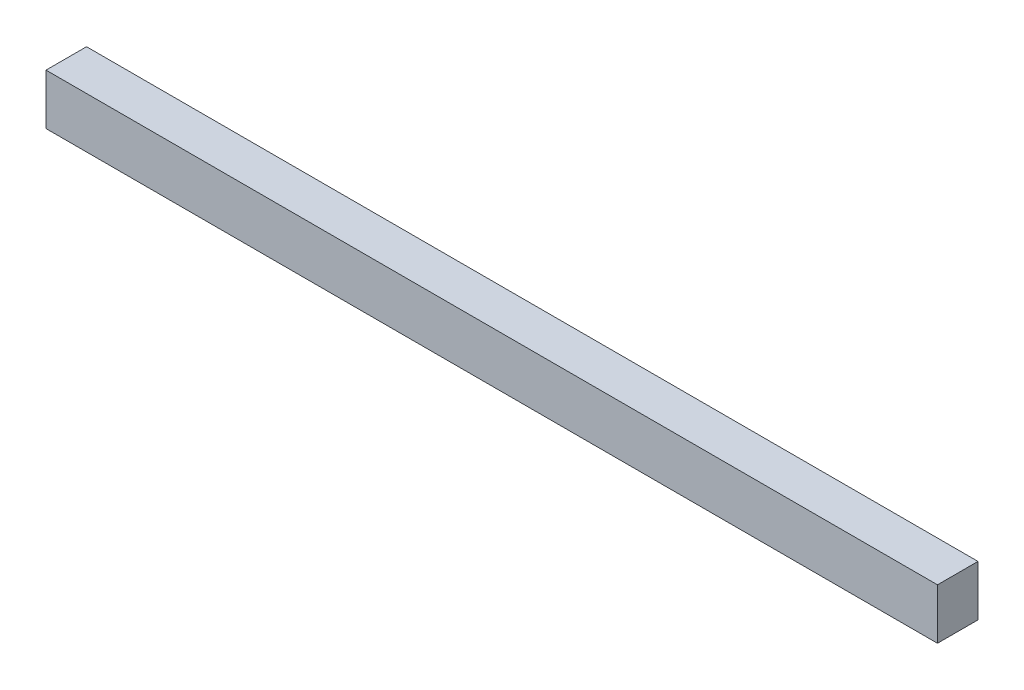
ISO-10303-21;
HEADER;
FILE_DESCRIPTION(('STEP AP214'),'2;1');
FILE_NAME('part.step','',(''),(''),'','','');
FILE_SCHEMA(('AUTOMOTIVE_DESIGN { 1 0 10303 214 1 1 1 1 }'));
ENDSEC;
DATA;
#1=APPLICATION_CONTEXT('core data for automotive mechanical design processes');
#2=APPLICATION_PROTOCOL_DEFINITION('international standard','automotive_design',2000,#1);
#3=PRODUCT_CONTEXT('',#1,'mechanical');
#4=PRODUCT('Part','Part','',(#3));
#5=PRODUCT_RELATED_PRODUCT_CATEGORY('part','',(#4));
#6=PRODUCT_DEFINITION_FORMATION('','',#4);
#7=PRODUCT_DEFINITION_CONTEXT('part definition',#1,'design');
#8=PRODUCT_DEFINITION('design','',#6,#7);
#9=PRODUCT_DEFINITION_SHAPE('','',#8);
#10=(LENGTH_UNIT() NAMED_UNIT(*) SI_UNIT(.MILLI.,.METRE.));
#11=(NAMED_UNIT(*) PLANE_ANGLE_UNIT() SI_UNIT($,.RADIAN.));
#12=(NAMED_UNIT(*) SI_UNIT($,.STERADIAN.) SOLID_ANGLE_UNIT());
#13=UNCERTAINTY_MEASURE_WITH_UNIT(LENGTH_MEASURE(1.E-05),#10,'distance_accuracy_value','');
#14=(GEOMETRIC_REPRESENTATION_CONTEXT(3) GLOBAL_UNCERTAINTY_ASSIGNED_CONTEXT((#13)) GLOBAL_UNIT_ASSIGNED_CONTEXT((#10,
#11,#12)) REPRESENTATION_CONTEXT('',''));
#15=CARTESIAN_POINT('',(0.,0.,0.));
#16=DIRECTION('',(0.,0.,1.));
#17=DIRECTION('',(1.,0.,0.));
#18=AXIS2_PLACEMENT_3D('',#15,#16,#17);
#19=CARTESIAN_POINT('',(220.,25.,-10.));
#20=DIRECTION('',(-1.,0.,0.));
#21=DIRECTION('',(0.,0.,1.));
#22=AXIS2_PLACEMENT_3D('',#19,#20,#21);
#23=PLANE('',#22);
#24=DIRECTION('',(0.,0.,-1.));
#25=VECTOR('',#24,1.);
#26=CARTESIAN_POINT('',(220.,0.,-10.));
#27=LINE('',#26,#25);
#28=CARTESIAN_POINT('',(220.,0.,10.));
#29=VERTEX_POINT('',#28);
#30=CARTESIAN_POINT('',(220.,0.,-10.));
#31=VERTEX_POINT('',#30);
#32=EDGE_CURVE('E165',#29,#31,#27,.T.);
#33=ORIENTED_EDGE('',*,*,#32,.T.);
#34=DIRECTION('',(0.,-1.,0.));
#35=VECTOR('',#34,1.);
#36=CARTESIAN_POINT('',(220.,25.,-10.));
#37=LINE('',#36,#35);
#38=CARTESIAN_POINT('',(220.,25.,-10.));
#39=VERTEX_POINT('',#38);
#40=EDGE_CURVE('E11',#39,#31,#37,.T.);
#41=ORIENTED_EDGE('',*,*,#40,.F.);
#42=DIRECTION('',(0.,0.,-1.));
#43=VECTOR('',#42,1.);
#44=CARTESIAN_POINT('',(220.,25.,-10.));
#45=LINE('',#44,#43);
#46=CARTESIAN_POINT('',(220.,25.,10.));
#47=VERTEX_POINT('',#46);
#48=EDGE_CURVE('E166',#47,#39,#45,.T.);
#49=ORIENTED_EDGE('',*,*,#48,.F.);
#50=DIRECTION('',(0.,-1.,0.));
#51=VECTOR('',#50,1.);
#52=CARTESIAN_POINT('',(220.,25.,10.));
#53=LINE('',#52,#51);
#54=EDGE_CURVE('E172',#47,#29,#53,.T.);
#55=ORIENTED_EDGE('',*,*,#54,.T.);
#56=EDGE_LOOP('',(#33,#41,#49,#55));
#57=FACE_BOUND('',#56,.T.);
#58=ADVANCED_FACE('F45',(#57),#23,.F.);
#59=CARTESIAN_POINT('',(-220.,25.,-10.));
#60=DIRECTION('',(0.,0.,1.));
#61=DIRECTION('',(1.,0.,0.));
#62=AXIS2_PLACEMENT_3D('',#59,#60,#61);
#63=PLANE('',#62);
#64=CARTESIAN_POINT('',(0.,12.5,-10.));
#65=DIRECTION('',(0.,0.,-1.));
#66=DIRECTION('',(-1.,0.,0.));
#67=AXIS2_PLACEMENT_3D('',#64,#65,#66);
#68=CIRCLE('',#67,2.09999999999999);
#69=CARTESIAN_POINT('',(-2.09999999999999,12.5,-10.));
#70=VERTEX_POINT('',#69);
#71=EDGE_CURVE('E125',#70,#70,#68,.T.);
#72=ORIENTED_EDGE('',*,*,#71,.F.);
#73=EDGE_LOOP('',(#72));
#74=FACE_BOUND('',#73,.T.);
#75=CARTESIAN_POINT('',(-60.,12.5,-10.));
#76=DIRECTION('',(0.,0.,-1.));
#77=DIRECTION('',(-1.,0.,0.));
#78=AXIS2_PLACEMENT_3D('',#75,#76,#77);
#79=CIRCLE('',#78,2.09999999999999);
#80=CARTESIAN_POINT('',(-62.1,12.5,-10.));
#81=VERTEX_POINT('',#80);
#82=EDGE_CURVE('E124',#81,#81,#79,.T.);
#83=ORIENTED_EDGE('',*,*,#82,.F.);
#84=EDGE_LOOP('',(#83));
#85=FACE_BOUND('',#84,.T.);
#86=CARTESIAN_POINT('',(-120.,12.5,-10.));
#87=DIRECTION('',(0.,0.,-1.));
#88=DIRECTION('',(-1.,0.,0.));
#89=AXIS2_PLACEMENT_3D('',#86,#87,#88);
#90=CIRCLE('',#89,2.09999999999999);
#91=CARTESIAN_POINT('',(-122.1,12.5,-10.));
#92=VERTEX_POINT('',#91);
#93=EDGE_CURVE('E135',#92,#92,#90,.T.);
#94=ORIENTED_EDGE('',*,*,#93,.F.);
#95=EDGE_LOOP('',(#94));
#96=FACE_BOUND('',#95,.T.);
#97=CARTESIAN_POINT('',(-180.,12.5,-10.));
#98=DIRECTION('',(0.,0.,-1.));
#99=DIRECTION('',(-1.,0.,0.));
#100=AXIS2_PLACEMENT_3D('',#97,#98,#99);
#101=CIRCLE('',#100,2.09999999999999);
#102=CARTESIAN_POINT('',(-182.1,12.5,-10.));
#103=VERTEX_POINT('',#102);
#104=EDGE_CURVE('E141',#103,#103,#101,.T.);
#105=ORIENTED_EDGE('',*,*,#104,.F.);
#106=EDGE_LOOP('',(#105));
#107=FACE_BOUND('',#106,.T.);
#108=CARTESIAN_POINT('',(60.,12.4999999999996,-10.));
#109=DIRECTION('',(0.,0.,-1.));
#110=DIRECTION('',(-1.,0.,0.));
#111=AXIS2_PLACEMENT_3D('',#108,#109,#110);
#112=CIRCLE('',#111,2.09999999999999);
#113=CARTESIAN_POINT('',(57.9,12.4999999999996,-10.));
#114=VERTEX_POINT('',#113);
#115=EDGE_CURVE('E147',#114,#114,#112,.T.);
#116=ORIENTED_EDGE('',*,*,#115,.F.);
#117=EDGE_LOOP('',(#116));
#118=FACE_BOUND('',#117,.T.);
#119=CARTESIAN_POINT('',(120.,12.4999999999992,-10.));
#120=DIRECTION('',(0.,0.,-1.));
#121=DIRECTION('',(-1.,0.,0.));
#122=AXIS2_PLACEMENT_3D('',#119,#120,#121);
#123=CIRCLE('',#122,2.09999999999999);
#124=CARTESIAN_POINT('',(117.9,12.4999999999992,-10.));
#125=VERTEX_POINT('',#124);
#126=EDGE_CURVE('E153',#125,#125,#123,.T.);
#127=ORIENTED_EDGE('',*,*,#126,.F.);
#128=EDGE_LOOP('',(#127));
#129=FACE_BOUND('',#128,.T.);
#130=CARTESIAN_POINT('',(180.,12.4999999999987,-10.));
#131=DIRECTION('',(0.,0.,-1.));
#132=DIRECTION('',(-1.,0.,0.));
#133=AXIS2_PLACEMENT_3D('',#130,#131,#132);
#134=CIRCLE('',#133,2.09999999999999);
#135=CARTESIAN_POINT('',(177.9,12.4999999999987,-10.));
#136=VERTEX_POINT('',#135);
#137=EDGE_CURVE('E159',#136,#136,#134,.T.);
#138=ORIENTED_EDGE('',*,*,#137,.F.);
#139=EDGE_LOOP('',(#138));
#140=FACE_BOUND('',#139,.T.);
#141=DIRECTION('',(-1.,0.,0.));
#142=VECTOR('',#141,1.);
#143=CARTESIAN_POINT('',(-220.,0.,-10.));
#144=LINE('',#143,#142);
#145=CARTESIAN_POINT('',(-220.,0.,-10.));
#146=VERTEX_POINT('',#145);
#147=EDGE_CURVE('E175',#31,#146,#144,.T.);
#148=ORIENTED_EDGE('',*,*,#147,.T.);
#149=DIRECTION('',(0.,-1.,0.));
#150=VECTOR('',#149,1.);
#151=CARTESIAN_POINT('',(-220.,25.,-10.));
#152=LINE('',#151,#150);
#153=CARTESIAN_POINT('',(-220.,25.,-10.));
#154=VERTEX_POINT('',#153);
#155=EDGE_CURVE('E53',#154,#146,#152,.T.);
#156=ORIENTED_EDGE('',*,*,#155,.F.);
#157=DIRECTION('',(-1.,0.,0.));
#158=VECTOR('',#157,1.);
#159=CARTESIAN_POINT('',(-220.,25.,-10.));
#160=LINE('',#159,#158);
#161=EDGE_CURVE('E92',#39,#154,#160,.T.);
#162=ORIENTED_EDGE('',*,*,#161,.F.);
#163=ORIENTED_EDGE('',*,*,#40,.T.);
#164=EDGE_LOOP('',(#148,#156,#162,#163));
#165=FACE_BOUND('',#164,.T.);
#166=ADVANCED_FACE('F198',(#74,#85,#96,#107,#118,#129,#140,#165),#63,.F.);
#167=CARTESIAN_POINT('',(-220.,25.,-10.));
#168=DIRECTION('',(1.,0.,0.));
#169=DIRECTION('',(0.,0.,-1.));
#170=AXIS2_PLACEMENT_3D('',#167,#168,#169);
#171=PLANE('',#170);
#172=DIRECTION('',(0.,0.,1.));
#173=VECTOR('',#172,1.);
#174=CARTESIAN_POINT('',(-220.,0.,-10.));
#175=LINE('',#174,#173);
#176=CARTESIAN_POINT('',(-220.,0.,10.));
#177=VERTEX_POINT('',#176);
#178=EDGE_CURVE('E79',#146,#177,#175,.T.);
#179=ORIENTED_EDGE('',*,*,#178,.T.);
#180=DIRECTION('',(0.,-1.,0.));
#181=VECTOR('',#180,1.);
#182=CARTESIAN_POINT('',(-220.,25.,10.));
#183=LINE('',#182,#181);
#184=CARTESIAN_POINT('',(-220.,25.,10.));
#185=VERTEX_POINT('',#184);
#186=EDGE_CURVE('E180',#185,#177,#183,.T.);
#187=ORIENTED_EDGE('',*,*,#186,.F.);
#188=DIRECTION('',(0.,0.,1.));
#189=VECTOR('',#188,1.);
#190=CARTESIAN_POINT('',(-220.,25.,-10.));
#191=LINE('',#190,#189);
#192=EDGE_CURVE('E169',#154,#185,#191,.T.);
#193=ORIENTED_EDGE('',*,*,#192,.F.);
#194=ORIENTED_EDGE('',*,*,#155,.T.);
#195=EDGE_LOOP('',(#179,#187,#193,#194));
#196=FACE_BOUND('',#195,.T.);
#197=ADVANCED_FACE('F182',(#196),#171,.F.);
#198=CARTESIAN_POINT('',(-220.,25.,10.));
#199=DIRECTION('',(0.,0.,-1.));
#200=DIRECTION('',(-1.,0.,0.));
#201=AXIS2_PLACEMENT_3D('',#198,#199,#200);
#202=PLANE('',#201);
#203=DIRECTION('',(1.,0.,0.));
#204=VECTOR('',#203,1.);
#205=CARTESIAN_POINT('',(-220.,0.,10.));
#206=LINE('',#205,#204);
#207=EDGE_CURVE('E85',#177,#29,#206,.T.);
#208=ORIENTED_EDGE('',*,*,#207,.T.);
#209=ORIENTED_EDGE('',*,*,#54,.F.);
#210=DIRECTION('',(1.,0.,0.));
#211=VECTOR('',#210,1.);
#212=CARTESIAN_POINT('',(-220.,25.,10.));
#213=LINE('',#212,#211);
#214=EDGE_CURVE('E61',#185,#47,#213,.T.);
#215=ORIENTED_EDGE('',*,*,#214,.F.);
#216=ORIENTED_EDGE('',*,*,#186,.T.);
#217=EDGE_LOOP('',(#208,#209,#215,#216));
#218=FACE_BOUND('',#217,.T.);
#219=ADVANCED_FACE('F189',(#218),#202,.F.);
#220=CARTESIAN_POINT('',(0.,25.,0.));
#221=DIRECTION('',(0.,1.,0.));
#222=DIRECTION('',(0.,0.,1.));
#223=AXIS2_PLACEMENT_3D('',#220,#221,#222);
#224=PLANE('',#223);
#225=ORIENTED_EDGE('',*,*,#48,.T.);
#226=ORIENTED_EDGE('',*,*,#161,.T.);
#227=ORIENTED_EDGE('',*,*,#192,.T.);
#228=ORIENTED_EDGE('',*,*,#214,.T.);
#229=EDGE_LOOP('',(#225,#226,#227,#228));
#230=FACE_BOUND('',#229,.T.);
#231=ADVANCED_FACE('F191',(#230),#224,.T.);
#232=CARTESIAN_POINT('',(0.,0.,0.));
#233=DIRECTION('',(0.,1.,0.));
#234=DIRECTION('',(0.,0.,1.));
#235=AXIS2_PLACEMENT_3D('',#232,#233,#234);
#236=PLANE('',#235);
#237=ORIENTED_EDGE('',*,*,#32,.F.);
#238=ORIENTED_EDGE('',*,*,#207,.F.);
#239=ORIENTED_EDGE('',*,*,#178,.F.);
#240=ORIENTED_EDGE('',*,*,#147,.F.);
#241=EDGE_LOOP('',(#237,#238,#239,#240));
#242=FACE_BOUND('',#241,.T.);
#243=ADVANCED_FACE('F185',(#242),#236,.F.);
#244=CARTESIAN_POINT('',(180.,12.4999999999987,5.));
#245=DIRECTION('',(0.,0.,-1.));
#246=DIRECTION('',(-1.,0.,0.));
#247=AXIS2_PLACEMENT_3D('',#244,#245,#246);
#248=CONICAL_SURFACE('',#247,2.09999999999999,1.02974425867665);
#249=CARTESIAN_POINT('',(180.,12.4999999999987,6.26180729995787));
#250=VERTEX_POINT('',#249);
#251=VERTEX_LOOP('',#250);
#252=FACE_BOUND('',#251,.T.);
#253=CARTESIAN_POINT('',(180.,12.4999999999987,5.));
#254=DIRECTION('',(0.,0.,-1.));
#255=DIRECTION('',(-1.,0.,0.));
#256=AXIS2_PLACEMENT_3D('',#253,#254,#255);
#257=CIRCLE('',#256,2.09999999999999);
#258=CARTESIAN_POINT('',(177.9,12.4999999999987,5.));
#259=VERTEX_POINT('',#258);
#260=EDGE_CURVE('E162',#259,#259,#257,.T.);
#261=ORIENTED_EDGE('',*,*,#260,.T.);
#262=EDGE_LOOP('',(#261));
#263=FACE_BOUND('',#262,.T.);
#264=ADVANCED_FACE('F225',(#252,#263),#248,.F.);
#265=CARTESIAN_POINT('',(180.,12.4999999999987,-10.));
#266=DIRECTION('',(0.,0.,-1.));
#267=DIRECTION('',(-1.,0.,0.));
#268=AXIS2_PLACEMENT_3D('',#265,#266,#267);
#269=CYLINDRICAL_SURFACE('',#268,2.09999999999999);
#270=ORIENTED_EDGE('',*,*,#260,.F.);
#271=EDGE_LOOP('',(#270));
#272=FACE_BOUND('',#271,.T.);
#273=ORIENTED_EDGE('',*,*,#137,.T.);
#274=EDGE_LOOP('',(#273));
#275=FACE_BOUND('',#274,.T.);
#276=ADVANCED_FACE('F222',(#272,#275),#269,.F.);
#277=CARTESIAN_POINT('',(120.,12.4999999999992,5.));
#278=DIRECTION('',(0.,0.,-1.));
#279=DIRECTION('',(-1.,0.,0.));
#280=AXIS2_PLACEMENT_3D('',#277,#278,#279);
#281=CONICAL_SURFACE('',#280,2.09999999999999,1.02974425867665);
#282=CARTESIAN_POINT('',(120.,12.4999999999992,6.26180729995787));
#283=VERTEX_POINT('',#282);
#284=VERTEX_LOOP('',#283);
#285=FACE_BOUND('',#284,.T.);
#286=CARTESIAN_POINT('',(120.,12.4999999999992,5.));
#287=DIRECTION('',(0.,0.,-1.));
#288=DIRECTION('',(-1.,0.,0.));
#289=AXIS2_PLACEMENT_3D('',#286,#287,#288);
#290=CIRCLE('',#289,2.09999999999999);
#291=CARTESIAN_POINT('',(117.9,12.4999999999992,5.));
#292=VERTEX_POINT('',#291);
#293=EDGE_CURVE('E156',#292,#292,#290,.T.);
#294=ORIENTED_EDGE('',*,*,#293,.T.);
#295=EDGE_LOOP('',(#294));
#296=FACE_BOUND('',#295,.T.);
#297=ADVANCED_FACE('F224',(#285,#296),#281,.F.);
#298=CARTESIAN_POINT('',(120.,12.4999999999992,-10.));
#299=DIRECTION('',(0.,0.,-1.));
#300=DIRECTION('',(-1.,0.,0.));
#301=AXIS2_PLACEMENT_3D('',#298,#299,#300);
#302=CYLINDRICAL_SURFACE('',#301,2.09999999999999);
#303=ORIENTED_EDGE('',*,*,#293,.F.);
#304=EDGE_LOOP('',(#303));
#305=FACE_BOUND('',#304,.T.);
#306=ORIENTED_EDGE('',*,*,#126,.T.);
#307=EDGE_LOOP('',(#306));
#308=FACE_BOUND('',#307,.T.);
#309=ADVANCED_FACE('F232',(#305,#308),#302,.F.);
#310=CARTESIAN_POINT('',(60.,12.4999999999996,5.));
#311=DIRECTION('',(0.,0.,-1.));
#312=DIRECTION('',(-1.,0.,0.));
#313=AXIS2_PLACEMENT_3D('',#310,#311,#312);
#314=CONICAL_SURFACE('',#313,2.1,1.02974425867665);
#315=CARTESIAN_POINT('',(60.,12.4999999999996,6.26180729995787));
#316=VERTEX_POINT('',#315);
#317=VERTEX_LOOP('',#316);
#318=FACE_BOUND('',#317,.T.);
#319=CARTESIAN_POINT('',(60.,12.4999999999996,5.));
#320=DIRECTION('',(0.,0.,-1.));
#321=DIRECTION('',(-1.,0.,0.));
#322=AXIS2_PLACEMENT_3D('',#319,#320,#321);
#323=CIRCLE('',#322,2.1);
#324=CARTESIAN_POINT('',(57.9,12.4999999999996,5.));
#325=VERTEX_POINT('',#324);
#326=EDGE_CURVE('E150',#325,#325,#323,.T.);
#327=ORIENTED_EDGE('',*,*,#326,.T.);
#328=EDGE_LOOP('',(#327));
#329=FACE_BOUND('',#328,.T.);
#330=ADVANCED_FACE('F277',(#318,#329),#314,.F.);
#331=CARTESIAN_POINT('',(60.,12.4999999999996,-10.));
#332=DIRECTION('',(0.,0.,-1.));
#333=DIRECTION('',(-1.,0.,0.));
#334=AXIS2_PLACEMENT_3D('',#331,#332,#333);
#335=CYLINDRICAL_SURFACE('',#334,2.09999999999999);
#336=ORIENTED_EDGE('',*,*,#326,.F.);
#337=EDGE_LOOP('',(#336));
#338=FACE_BOUND('',#337,.T.);
#339=ORIENTED_EDGE('',*,*,#115,.T.);
#340=EDGE_LOOP('',(#339));
#341=FACE_BOUND('',#340,.T.);
#342=ADVANCED_FACE('F287',(#338,#341),#335,.F.);
#343=CARTESIAN_POINT('',(-180.,12.5,5.));
#344=DIRECTION('',(0.,0.,-1.));
#345=DIRECTION('',(-1.,0.,0.));
#346=AXIS2_PLACEMENT_3D('',#343,#344,#345);
#347=CONICAL_SURFACE('',#346,2.09999999999999,1.02974425867665);
#348=CARTESIAN_POINT('',(-180.,12.5,6.26180729995787));
#349=VERTEX_POINT('',#348);
#350=VERTEX_LOOP('',#349);
#351=FACE_BOUND('',#350,.T.);
#352=CARTESIAN_POINT('',(-180.,12.5,5.));
#353=DIRECTION('',(0.,0.,-1.));
#354=DIRECTION('',(-1.,0.,0.));
#355=AXIS2_PLACEMENT_3D('',#352,#353,#354);
#356=CIRCLE('',#355,2.09999999999999);
#357=CARTESIAN_POINT('',(-182.1,12.5,5.));
#358=VERTEX_POINT('',#357);
#359=EDGE_CURVE('E144',#358,#358,#356,.T.);
#360=ORIENTED_EDGE('',*,*,#359,.T.);
#361=EDGE_LOOP('',(#360));
#362=FACE_BOUND('',#361,.T.);
#363=ADVANCED_FACE('F298',(#351,#362),#347,.F.);
#364=CARTESIAN_POINT('',(-180.,12.5,-10.));
#365=DIRECTION('',(0.,0.,-1.));
#366=DIRECTION('',(-1.,0.,0.));
#367=AXIS2_PLACEMENT_3D('',#364,#365,#366);
#368=CYLINDRICAL_SURFACE('',#367,2.09999999999999);
#369=ORIENTED_EDGE('',*,*,#359,.F.);
#370=EDGE_LOOP('',(#369));
#371=FACE_BOUND('',#370,.T.);
#372=ORIENTED_EDGE('',*,*,#104,.T.);
#373=EDGE_LOOP('',(#372));
#374=FACE_BOUND('',#373,.T.);
#375=ADVANCED_FACE('F309',(#371,#374),#368,.F.);
#376=CARTESIAN_POINT('',(-120.,12.5,5.));
#377=DIRECTION('',(0.,0.,-1.));
#378=DIRECTION('',(-1.,0.,0.));
#379=AXIS2_PLACEMENT_3D('',#376,#377,#378);
#380=CONICAL_SURFACE('',#379,2.09999999999999,1.02974425867665);
#381=CARTESIAN_POINT('',(-120.,12.5,6.26180729995787));
#382=VERTEX_POINT('',#381);
#383=VERTEX_LOOP('',#382);
#384=FACE_BOUND('',#383,.T.);
#385=CARTESIAN_POINT('',(-120.,12.5,5.));
#386=DIRECTION('',(0.,0.,-1.));
#387=DIRECTION('',(-1.,0.,0.));
#388=AXIS2_PLACEMENT_3D('',#385,#386,#387);
#389=CIRCLE('',#388,2.09999999999999);
#390=CARTESIAN_POINT('',(-122.1,12.5,5.));
#391=VERTEX_POINT('',#390);
#392=EDGE_CURVE('E138',#391,#391,#389,.T.);
#393=ORIENTED_EDGE('',*,*,#392,.T.);
#394=EDGE_LOOP('',(#393));
#395=FACE_BOUND('',#394,.T.);
#396=ADVANCED_FACE('F319',(#384,#395),#380,.F.);
#397=CARTESIAN_POINT('',(-120.,12.5,-10.));
#398=DIRECTION('',(0.,0.,-1.));
#399=DIRECTION('',(-1.,0.,0.));
#400=AXIS2_PLACEMENT_3D('',#397,#398,#399);
#401=CYLINDRICAL_SURFACE('',#400,2.09999999999999);
#402=ORIENTED_EDGE('',*,*,#392,.F.);
#403=EDGE_LOOP('',(#402));
#404=FACE_BOUND('',#403,.T.);
#405=ORIENTED_EDGE('',*,*,#93,.T.);
#406=EDGE_LOOP('',(#405));
#407=FACE_BOUND('',#406,.T.);
#408=ADVANCED_FACE('F331',(#404,#407),#401,.F.);
#409=CARTESIAN_POINT('',(-60.,12.5,5.));
#410=DIRECTION('',(0.,0.,-1.));
#411=DIRECTION('',(-1.,0.,0.));
#412=AXIS2_PLACEMENT_3D('',#409,#410,#411);
#413=CONICAL_SURFACE('',#412,2.1,1.02974425867665);
#414=CARTESIAN_POINT('',(-60.,12.5,6.26180729995787));
#415=VERTEX_POINT('',#414);
#416=VERTEX_LOOP('',#415);
#417=FACE_BOUND('',#416,.T.);
#418=CARTESIAN_POINT('',(-60.,12.5,5.));
#419=DIRECTION('',(0.,0.,-1.));
#420=DIRECTION('',(-1.,0.,0.));
#421=AXIS2_PLACEMENT_3D('',#418,#419,#420);
#422=CIRCLE('',#421,2.1);
#423=CARTESIAN_POINT('',(-62.1,12.5,5.));
#424=VERTEX_POINT('',#423);
#425=EDGE_CURVE('E128',#424,#424,#422,.T.);
#426=ORIENTED_EDGE('',*,*,#425,.T.);
#427=EDGE_LOOP('',(#426));
#428=FACE_BOUND('',#427,.T.);
#429=ADVANCED_FACE('F342',(#417,#428),#413,.F.);
#430=CARTESIAN_POINT('',(-60.,12.5,-10.));
#431=DIRECTION('',(0.,0.,-1.));
#432=DIRECTION('',(-1.,0.,0.));
#433=AXIS2_PLACEMENT_3D('',#430,#431,#432);
#434=CYLINDRICAL_SURFACE('',#433,2.09999999999999);
#435=ORIENTED_EDGE('',*,*,#425,.F.);
#436=EDGE_LOOP('',(#435));
#437=FACE_BOUND('',#436,.T.);
#438=ORIENTED_EDGE('',*,*,#82,.T.);
#439=EDGE_LOOP('',(#438));
#440=FACE_BOUND('',#439,.T.);
#441=ADVANCED_FACE('F118',(#437,#440),#434,.F.);
#442=CARTESIAN_POINT('',(0.,12.5,5.));
#443=DIRECTION('',(0.,0.,-1.));
#444=DIRECTION('',(-1.,0.,0.));
#445=AXIS2_PLACEMENT_3D('',#442,#443,#444);
#446=CONICAL_SURFACE('',#445,2.1,1.02974425867665);
#447=CARTESIAN_POINT('',(0.,12.5,6.26180729995787));
#448=VERTEX_POINT('',#447);
#449=VERTEX_LOOP('',#448);
#450=FACE_BOUND('',#449,.T.);
#451=CARTESIAN_POINT('',(0.,12.5,5.));
#452=DIRECTION('',(0.,0.,-1.));
#453=DIRECTION('',(-1.,0.,0.));
#454=AXIS2_PLACEMENT_3D('',#451,#452,#453);
#455=CIRCLE('',#454,2.1);
#456=CARTESIAN_POINT('',(-2.1,12.5,5.));
#457=VERTEX_POINT('',#456);
#458=EDGE_CURVE('E122',#457,#457,#455,.T.);
#459=ORIENTED_EDGE('',*,*,#458,.T.);
#460=EDGE_LOOP('',(#459));
#461=FACE_BOUND('',#460,.T.);
#462=ADVANCED_FACE('F114',(#450,#461),#446,.F.);
#463=CARTESIAN_POINT('',(0.,12.5,-10.));
#464=DIRECTION('',(0.,0.,-1.));
#465=DIRECTION('',(-1.,0.,0.));
#466=AXIS2_PLACEMENT_3D('',#463,#464,#465);
#467=CYLINDRICAL_SURFACE('',#466,2.09999999999999);
#468=ORIENTED_EDGE('',*,*,#458,.F.);
#469=EDGE_LOOP('',(#468));
#470=FACE_BOUND('',#469,.T.);
#471=ORIENTED_EDGE('',*,*,#71,.T.);
#472=EDGE_LOOP('',(#471));
#473=FACE_BOUND('',#472,.T.);
#474=ADVANCED_FACE('F117',(#470,#473),#467,.F.);
#475=CLOSED_SHELL('',(#58,#166,#197,#219,#231,#243,#264,#276,#297,#309,#330,#342,#363,#375,#396,
#408,#429,#441,#462,#474));
#476=MANIFOLD_SOLID_BREP('B2',#475);
#477=ADVANCED_BREP_SHAPE_REPRESENTATION('',(#18,#476),#14);
#478=SHAPE_DEFINITION_REPRESENTATION(#9,#477);
ENDSEC;
END-ISO-10303-21;
